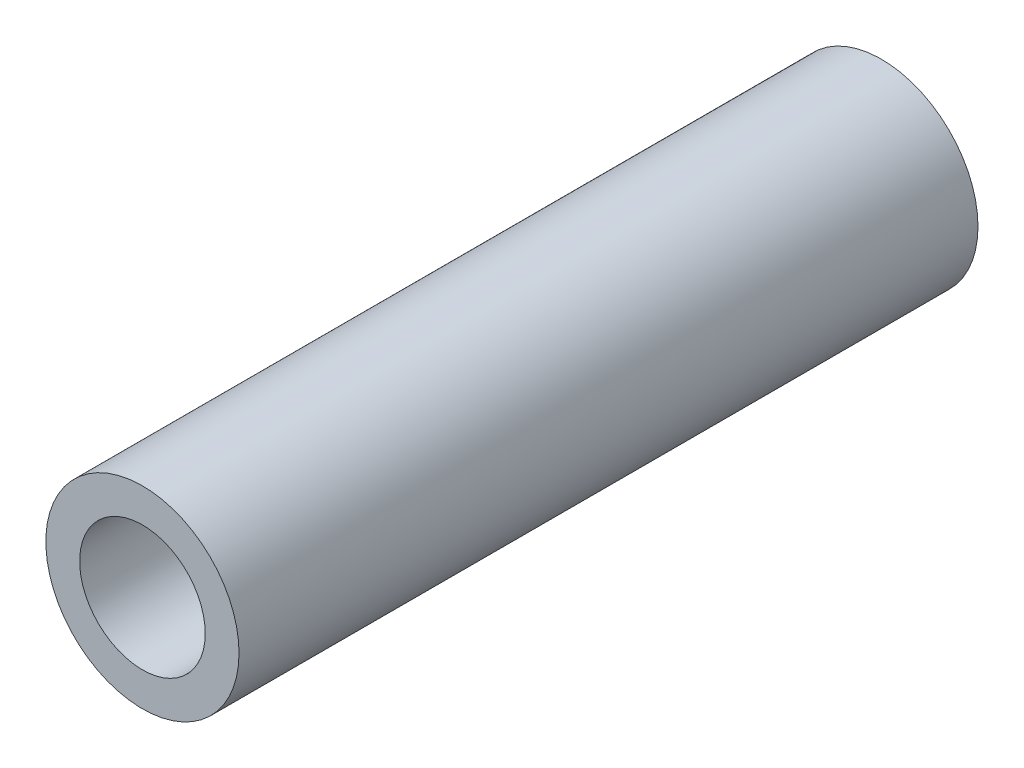
ISO-10303-21;
HEADER;
FILE_DESCRIPTION(('STEP AP214'),'2;1');
FILE_NAME('part.step','',(''),(''),'','','');
FILE_SCHEMA(('AUTOMOTIVE_DESIGN { 1 0 10303 214 1 1 1 1 }'));
ENDSEC;
DATA;
#1=APPLICATION_CONTEXT('core data for automotive mechanical design processes');
#2=APPLICATION_PROTOCOL_DEFINITION('international standard','automotive_design',2000,#1);
#3=PRODUCT_CONTEXT('',#1,'mechanical');
#4=PRODUCT('Part','Part','',(#3));
#5=PRODUCT_RELATED_PRODUCT_CATEGORY('part','',(#4));
#6=PRODUCT_DEFINITION_FORMATION('','',#4);
#7=PRODUCT_DEFINITION_CONTEXT('part definition',#1,'design');
#8=PRODUCT_DEFINITION('design','',#6,#7);
#9=PRODUCT_DEFINITION_SHAPE('','',#8);
#10=(LENGTH_UNIT() NAMED_UNIT(*) SI_UNIT(.MILLI.,.METRE.));
#11=(NAMED_UNIT(*) PLANE_ANGLE_UNIT() SI_UNIT($,.RADIAN.));
#12=(NAMED_UNIT(*) SI_UNIT($,.STERADIAN.) SOLID_ANGLE_UNIT());
#13=UNCERTAINTY_MEASURE_WITH_UNIT(LENGTH_MEASURE(1.E-05),#10,'distance_accuracy_value','');
#14=(GEOMETRIC_REPRESENTATION_CONTEXT(3) GLOBAL_UNCERTAINTY_ASSIGNED_CONTEXT((#13)) GLOBAL_UNIT_ASSIGNED_CONTEXT((#10,
#11,#12)) REPRESENTATION_CONTEXT('',''));
#15=CARTESIAN_POINT('',(0.,0.,0.));
#16=DIRECTION('',(0.,0.,1.));
#17=DIRECTION('',(1.,0.,0.));
#18=AXIS2_PLACEMENT_3D('',#15,#16,#17);
#19=CARTESIAN_POINT('',(0.,0.,-15.3));
#20=DIRECTION('',(0.,0.,1.));
#21=DIRECTION('',(1.,0.,0.));
#22=AXIS2_PLACEMENT_3D('',#19,#20,#21);
#23=CYLINDRICAL_SURFACE('',#22,2.);
#24=CARTESIAN_POINT('',(0.,0.,-15.3));
#25=DIRECTION('',(0.,0.,1.));
#26=DIRECTION('',(1.,0.,0.));
#27=AXIS2_PLACEMENT_3D('',#24,#25,#26);
#28=CIRCLE('',#27,2.);
#29=CARTESIAN_POINT('',(2.,0.,-15.3));
#30=VERTEX_POINT('',#29);
#31=EDGE_CURVE('E10',#30,#30,#28,.T.);
#32=ORIENTED_EDGE('',*,*,#31,.T.);
#33=EDGE_LOOP('',(#32));
#34=FACE_BOUND('',#33,.T.);
#35=CARTESIAN_POINT('',(0.,0.,0.));
#36=DIRECTION('',(0.,0.,1.));
#37=DIRECTION('',(1.,0.,0.));
#38=AXIS2_PLACEMENT_3D('',#35,#36,#37);
#39=CIRCLE('',#38,2.);
#40=CARTESIAN_POINT('',(2.,0.,0.));
#41=VERTEX_POINT('',#40);
#42=EDGE_CURVE('E34',#41,#41,#39,.T.);
#43=ORIENTED_EDGE('',*,*,#42,.F.);
#44=EDGE_LOOP('',(#43));
#45=FACE_BOUND('',#44,.T.);
#46=ADVANCED_FACE('F31',(#34,#45),#23,.T.);
#47=CARTESIAN_POINT('',(0.,0.,-15.3));
#48=DIRECTION('',(0.,0.,1.));
#49=DIRECTION('',(1.,0.,0.));
#50=AXIS2_PLACEMENT_3D('',#47,#48,#49);
#51=PLANE('',#50);
#52=CARTESIAN_POINT('',(0.,0.,-15.3));
#53=DIRECTION('',(0.,0.,1.));
#54=DIRECTION('',(1.,0.,0.));
#55=AXIS2_PLACEMENT_3D('',#52,#53,#54);
#56=CIRCLE('',#55,1.3);
#57=CARTESIAN_POINT('',(1.3,0.,-15.3));
#58=VERTEX_POINT('',#57);
#59=EDGE_CURVE('E41',#58,#58,#56,.T.);
#60=ORIENTED_EDGE('',*,*,#59,.T.);
#61=EDGE_LOOP('',(#60));
#62=FACE_BOUND('',#61,.T.);
#63=ORIENTED_EDGE('',*,*,#31,.F.);
#64=EDGE_LOOP('',(#63));
#65=FACE_BOUND('',#64,.T.);
#66=ADVANCED_FACE('F49',(#62,#65),#51,.F.);
#67=CARTESIAN_POINT('',(0.,0.,0.));
#68=DIRECTION('',(0.,0.,1.));
#69=DIRECTION('',(1.,0.,0.));
#70=AXIS2_PLACEMENT_3D('',#67,#68,#69);
#71=PLANE('',#70);
#72=CARTESIAN_POINT('',(0.,0.,0.));
#73=DIRECTION('',(0.,0.,1.));
#74=DIRECTION('',(1.,0.,0.));
#75=AXIS2_PLACEMENT_3D('',#72,#73,#74);
#76=CIRCLE('',#75,1.3);
#77=CARTESIAN_POINT('',(1.3,0.,0.));
#78=VERTEX_POINT('',#77);
#79=EDGE_CURVE('E43',#78,#78,#76,.T.);
#80=ORIENTED_EDGE('',*,*,#79,.F.);
#81=EDGE_LOOP('',(#80));
#82=FACE_BOUND('',#81,.T.);
#83=ORIENTED_EDGE('',*,*,#42,.T.);
#84=EDGE_LOOP('',(#83));
#85=FACE_BOUND('',#84,.T.);
#86=ADVANCED_FACE('F55',(#82,#85),#71,.T.);
#87=CARTESIAN_POINT('',(0.,0.,-15.3));
#88=DIRECTION('',(0.,0.,1.));
#89=DIRECTION('',(1.,0.,0.));
#90=AXIS2_PLACEMENT_3D('',#87,#88,#89);
#91=CYLINDRICAL_SURFACE('',#90,1.3);
#92=ORIENTED_EDGE('',*,*,#59,.F.);
#93=EDGE_LOOP('',(#92));
#94=FACE_BOUND('',#93,.T.);
#95=ORIENTED_EDGE('',*,*,#79,.T.);
#96=EDGE_LOOP('',(#95));
#97=FACE_BOUND('',#96,.T.);
#98=ADVANCED_FACE('F52',(#94,#97),#91,.F.);
#99=CLOSED_SHELL('',(#46,#66,#86,#98));
#100=MANIFOLD_SOLID_BREP('B2',#99);
#101=ADVANCED_BREP_SHAPE_REPRESENTATION('',(#18,#100),#14);
#102=SHAPE_DEFINITION_REPRESENTATION(#9,#101);
ENDSEC;
END-ISO-10303-21;
